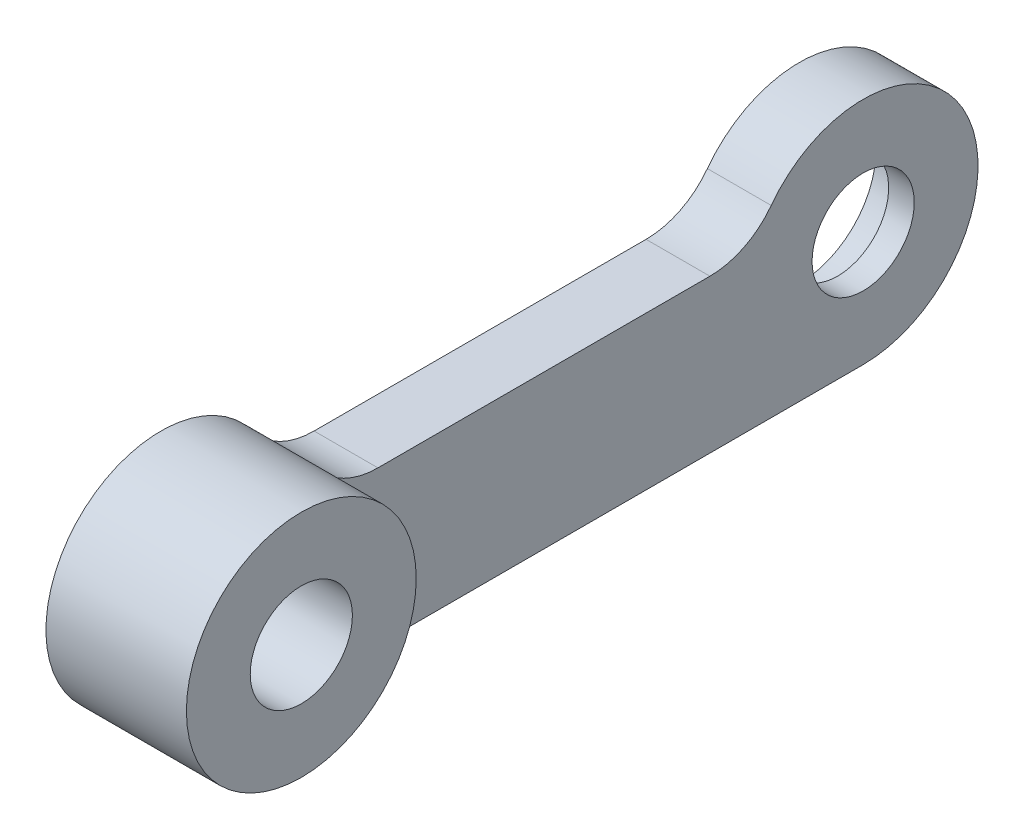
ISO-10303-21;
HEADER;
FILE_DESCRIPTION(('STEP AP214'),'2;1');
FILE_NAME('part.step','',(''),(''),'','','');
FILE_SCHEMA(('AUTOMOTIVE_DESIGN { 1 0 10303 214 1 1 1 1 }'));
ENDSEC;
DATA;
#1=APPLICATION_CONTEXT('core data for automotive mechanical design processes');
#2=APPLICATION_PROTOCOL_DEFINITION('international standard','automotive_design',2000,#1);
#3=PRODUCT_CONTEXT('',#1,'mechanical');
#4=PRODUCT('Part','Part','',(#3));
#5=PRODUCT_RELATED_PRODUCT_CATEGORY('part','',(#4));
#6=PRODUCT_DEFINITION_FORMATION('','',#4);
#7=PRODUCT_DEFINITION_CONTEXT('part definition',#1,'design');
#8=PRODUCT_DEFINITION('design','',#6,#7);
#9=PRODUCT_DEFINITION_SHAPE('','',#8);
#10=(LENGTH_UNIT() NAMED_UNIT(*) SI_UNIT(.MILLI.,.METRE.));
#11=(NAMED_UNIT(*) PLANE_ANGLE_UNIT() SI_UNIT($,.RADIAN.));
#12=(NAMED_UNIT(*) SI_UNIT($,.STERADIAN.) SOLID_ANGLE_UNIT());
#13=UNCERTAINTY_MEASURE_WITH_UNIT(LENGTH_MEASURE(1.E-05),#10,'distance_accuracy_value','');
#14=(GEOMETRIC_REPRESENTATION_CONTEXT(3) GLOBAL_UNCERTAINTY_ASSIGNED_CONTEXT((#13)) GLOBAL_UNIT_ASSIGNED_CONTEXT((#10,
#11,#12)) REPRESENTATION_CONTEXT('',''));
#15=CARTESIAN_POINT('',(0.,0.,0.));
#16=DIRECTION('',(0.,0.,1.));
#17=DIRECTION('',(1.,0.,0.));
#18=AXIS2_PLACEMENT_3D('',#15,#16,#17);
#19=CARTESIAN_POINT('',(5.5,-1.5,0.));
#20=DIRECTION('',(-1.,0.,0.));
#21=DIRECTION('',(0.,0.,1.));
#22=AXIS2_PLACEMENT_3D('',#19,#20,#21);
#23=CYLINDRICAL_SURFACE('',#22,2.);
#24=CARTESIAN_POINT('',(5.5,-1.5,0.));
#25=DIRECTION('',(1.,0.,0.));
#26=DIRECTION('',(0.,0.,-1.));
#27=AXIS2_PLACEMENT_3D('',#24,#25,#26);
#28=CIRCLE('',#27,2.);
#29=CARTESIAN_POINT('',(5.5,-1.5,-2.));
#30=VERTEX_POINT('',#29);
#31=EDGE_CURVE('E193',#30,#30,#28,.T.);
#32=ORIENTED_EDGE('',*,*,#31,.T.);
#33=EDGE_LOOP('',(#32));
#34=FACE_BOUND('',#33,.T.);
#35=CARTESIAN_POINT('',(1.5,-1.5,0.));
#36=DIRECTION('',(-1.,0.,0.));
#37=DIRECTION('',(0.,0.,1.));
#38=AXIS2_PLACEMENT_3D('',#35,#36,#37);
#39=CIRCLE('',#38,2.);
#40=CARTESIAN_POINT('',(1.5,-1.5,2.));
#41=VERTEX_POINT('',#40);
#42=EDGE_CURVE('E73',#41,#41,#39,.T.);
#43=ORIENTED_EDGE('',*,*,#42,.T.);
#44=EDGE_LOOP('',(#43));
#45=FACE_BOUND('',#44,.T.);
#46=ADVANCED_FACE('F69',(#34,#45),#23,.F.);
#47=CARTESIAN_POINT('',(5.5,-1.5,-25.));
#48=DIRECTION('',(-1.,0.,0.));
#49=DIRECTION('',(0.,0.,1.));
#50=AXIS2_PLACEMENT_3D('',#47,#48,#49);
#51=CYLINDRICAL_SURFACE('',#50,2.);
#52=CARTESIAN_POINT('',(2.5,-1.5,-25.));
#53=DIRECTION('',(1.,0.,0.));
#54=DIRECTION('',(0.,0.,-1.));
#55=AXIS2_PLACEMENT_3D('',#52,#53,#54);
#56=CIRCLE('',#55,2.);
#57=CARTESIAN_POINT('',(2.5,-1.5,-27.));
#58=VERTEX_POINT('',#57);
#59=EDGE_CURVE('E214',#58,#58,#56,.F.);
#60=ORIENTED_EDGE('',*,*,#59,.F.);
#61=EDGE_LOOP('',(#60));
#62=FACE_BOUND('',#61,.T.);
#63=CARTESIAN_POINT('',(1.5,-1.5,-25.));
#64=DIRECTION('',(-1.,0.,0.));
#65=DIRECTION('',(0.,0.,1.));
#66=AXIS2_PLACEMENT_3D('',#63,#64,#65);
#67=CIRCLE('',#66,2.);
#68=CARTESIAN_POINT('',(1.5,-1.5,-23.));
#69=VERTEX_POINT('',#68);
#70=EDGE_CURVE('E184',#69,#69,#67,.T.);
#71=ORIENTED_EDGE('',*,*,#70,.T.);
#72=EDGE_LOOP('',(#71));
#73=FACE_BOUND('',#72,.T.);
#74=ADVANCED_FACE('F241',(#62,#73),#51,.F.);
#75=CARTESIAN_POINT('',(2.5,-1.5,0.));
#76=DIRECTION('',(1.,0.,0.));
#77=DIRECTION('',(0.,0.,-1.));
#78=AXIS2_PLACEMENT_3D('',#75,#76,#77);
#79=PLANE('',#78);
#80=ORIENTED_EDGE('',*,*,#59,.T.);
#81=EDGE_LOOP('',(#80));
#82=FACE_BOUND('',#81,.T.);
#83=CARTESIAN_POINT('',(2.5,-1.5,0.));
#84=DIRECTION('',(1.,0.,0.));
#85=DIRECTION('',(0.,0.,-1.));
#86=AXIS2_PLACEMENT_3D('',#83,#84,#85);
#87=CIRCLE('',#86,4.5);
#88=CARTESIAN_POINT('',(2.5,-6.,0.));
#89=VERTEX_POINT('',#88);
#90=CARTESIAN_POINT('',(2.5,1.2,-3.6));
#91=VERTEX_POINT('',#90);
#92=EDGE_CURVE('E87',#89,#91,#87,.T.);
#93=ORIENTED_EDGE('',*,*,#92,.F.);
#94=DIRECTION('',(0.,0.,-1.));
#95=VECTOR('',#94,1.);
#96=CARTESIAN_POINT('',(2.5,-6.,0.));
#97=LINE('',#96,#95);
#98=CARTESIAN_POINT('',(2.5,-6.,-25.));
#99=VERTEX_POINT('',#98);
#100=EDGE_CURVE('E139',#89,#99,#97,.T.);
#101=ORIENTED_EDGE('',*,*,#100,.T.);
#102=CARTESIAN_POINT('',(2.5,-1.5,-25.));
#103=DIRECTION('',(1.,0.,0.));
#104=DIRECTION('',(0.,0.,-1.));
#105=AXIS2_PLACEMENT_3D('',#102,#103,#104);
#106=CIRCLE('',#105,4.5);
#107=CARTESIAN_POINT('',(2.5,1.2,-21.4));
#108=VERTEX_POINT('',#107);
#109=EDGE_CURVE('E148',#99,#108,#106,.T.);
#110=ORIENTED_EDGE('',*,*,#109,.T.);
#111=CARTESIAN_POINT('',(2.5,3.,-19.));
#112=DIRECTION('',(1.,0.,0.));
#113=DIRECTION('',(0.,0.,-1.));
#114=AXIS2_PLACEMENT_3D('',#111,#112,#113);
#115=CIRCLE('',#114,3.);
#116=CARTESIAN_POINT('',(2.5,0.,-19.));
#117=VERTEX_POINT('',#116);
#118=EDGE_CURVE('E180',#108,#117,#115,.F.);
#119=ORIENTED_EDGE('',*,*,#118,.T.);
#120=DIRECTION('',(0.,0.,-1.));
#121=VECTOR('',#120,1.);
#122=CARTESIAN_POINT('',(2.5,0.,0.));
#123=LINE('',#122,#121);
#124=CARTESIAN_POINT('',(2.5,0.,-6.));
#125=VERTEX_POINT('',#124);
#126=EDGE_CURVE('E157',#125,#117,#123,.T.);
#127=ORIENTED_EDGE('',*,*,#126,.F.);
#128=CARTESIAN_POINT('',(2.5,3.,-6.));
#129=DIRECTION('',(1.,0.,0.));
#130=DIRECTION('',(0.,0.,-1.));
#131=AXIS2_PLACEMENT_3D('',#128,#129,#130);
#132=CIRCLE('',#131,3.);
#133=EDGE_CURVE('E12',#125,#91,#132,.F.);
#134=ORIENTED_EDGE('',*,*,#133,.T.);
#135=EDGE_LOOP('',(#93,#101,#110,#119,#127,#134));
#136=FACE_BOUND('',#135,.T.);
#137=ADVANCED_FACE('F239',(#82,#136),#79,.T.);
#138=CARTESIAN_POINT('',(2.5,-1.5,0.));
#139=DIRECTION('',(-1.,0.,0.));
#140=DIRECTION('',(0.,0.,1.));
#141=AXIS2_PLACEMENT_3D('',#138,#139,#140);
#142=CYLINDRICAL_SURFACE('',#141,4.5);
#143=ORIENTED_EDGE('',*,*,#92,.T.);
#144=DIRECTION('',(-1.,0.,0.));
#145=VECTOR('',#144,1.);
#146=CARTESIAN_POINT('',(2.5,1.2,-3.6));
#147=LINE('',#146,#145);
#148=CARTESIAN_POINT('',(0.,1.2,-3.6));
#149=VERTEX_POINT('',#148);
#150=EDGE_CURVE('E128',#91,#149,#147,.T.);
#151=ORIENTED_EDGE('',*,*,#150,.T.);
#152=CARTESIAN_POINT('',(0.,-1.5,0.));
#153=DIRECTION('',(1.,0.,0.));
#154=DIRECTION('',(0.,0.,-1.));
#155=AXIS2_PLACEMENT_3D('',#152,#153,#154);
#156=CIRCLE('',#155,4.5);
#157=CARTESIAN_POINT('',(0.,-6.,0.));
#158=VERTEX_POINT('',#157);
#159=EDGE_CURVE('E122',#149,#158,#156,.T.);
#160=ORIENTED_EDGE('',*,*,#159,.T.);
#161=DIRECTION('',(-1.,0.,0.));
#162=VECTOR('',#161,1.);
#163=CARTESIAN_POINT('',(2.5,-6.,0.));
#164=LINE('',#163,#162);
#165=EDGE_CURVE('E126',#89,#158,#164,.T.);
#166=ORIENTED_EDGE('',*,*,#165,.F.);
#167=EDGE_LOOP('',(#143,#151,#160,#166));
#168=FACE_BOUND('',#167,.T.);
#169=CARTESIAN_POINT('',(5.5,-1.5,0.));
#170=DIRECTION('',(1.,0.,0.));
#171=DIRECTION('',(0.,0.,-1.));
#172=AXIS2_PLACEMENT_3D('',#169,#170,#171);
#173=CIRCLE('',#172,4.5);
#174=CARTESIAN_POINT('',(5.5,-1.5,-4.5));
#175=VERTEX_POINT('',#174);
#176=EDGE_CURVE('E164',#175,#175,#173,.T.);
#177=ORIENTED_EDGE('',*,*,#176,.F.);
#178=EDGE_LOOP('',(#177));
#179=FACE_BOUND('',#178,.T.);
#180=ADVANCED_FACE('F124',(#168,#179),#142,.T.);
#181=CARTESIAN_POINT('',(0.,-1.5,0.));
#182=DIRECTION('',(1.,0.,0.));
#183=DIRECTION('',(0.,0.,-1.));
#184=AXIS2_PLACEMENT_3D('',#181,#182,#183);
#185=PLANE('',#184);
#186=CARTESIAN_POINT('',(0.,-1.5,-25.));
#187=DIRECTION('',(-1.,0.,0.));
#188=DIRECTION('',(0.,0.,1.));
#189=AXIS2_PLACEMENT_3D('',#186,#187,#188);
#190=CIRCLE('',#189,3.);
#191=CARTESIAN_POINT('',(0.,-1.5,-22.));
#192=VERTEX_POINT('',#191);
#193=EDGE_CURVE('E195',#192,#192,#190,.T.);
#194=ORIENTED_EDGE('',*,*,#193,.F.);
#195=EDGE_LOOP('',(#194));
#196=FACE_BOUND('',#195,.T.);
#197=CARTESIAN_POINT('',(0.,-1.5,0.));
#198=DIRECTION('',(-1.,0.,0.));
#199=DIRECTION('',(0.,0.,1.));
#200=AXIS2_PLACEMENT_3D('',#197,#198,#199);
#201=CIRCLE('',#200,3.);
#202=CARTESIAN_POINT('',(0.,-1.5,3.));
#203=VERTEX_POINT('',#202);
#204=EDGE_CURVE('E207',#203,#203,#201,.T.);
#205=ORIENTED_EDGE('',*,*,#204,.F.);
#206=EDGE_LOOP('',(#205));
#207=FACE_BOUND('',#206,.T.);
#208=CARTESIAN_POINT('',(0.,-1.5,-25.));
#209=DIRECTION('',(1.,0.,0.));
#210=DIRECTION('',(0.,0.,-1.));
#211=AXIS2_PLACEMENT_3D('',#208,#209,#210);
#212=CIRCLE('',#211,4.5);
#213=CARTESIAN_POINT('',(0.,-6.,-25.));
#214=VERTEX_POINT('',#213);
#215=CARTESIAN_POINT('',(0.,1.2,-21.4));
#216=VERTEX_POINT('',#215);
#217=EDGE_CURVE('E145',#214,#216,#212,.T.);
#218=ORIENTED_EDGE('',*,*,#217,.F.);
#219=DIRECTION('',(0.,0.,-1.));
#220=VECTOR('',#219,1.);
#221=CARTESIAN_POINT('',(0.,-6.,0.));
#222=LINE('',#221,#220);
#223=EDGE_CURVE('E137',#158,#214,#222,.T.);
#224=ORIENTED_EDGE('',*,*,#223,.F.);
#225=ORIENTED_EDGE('',*,*,#159,.F.);
#226=CARTESIAN_POINT('',(0.,3.,-6.));
#227=DIRECTION('',(1.,0.,0.));
#228=DIRECTION('',(0.,0.,-1.));
#229=AXIS2_PLACEMENT_3D('',#226,#227,#228);
#230=CIRCLE('',#229,3.);
#231=CARTESIAN_POINT('',(0.,0.,-6.));
#232=VERTEX_POINT('',#231);
#233=EDGE_CURVE('E79',#149,#232,#230,.T.);
#234=ORIENTED_EDGE('',*,*,#233,.T.);
#235=DIRECTION('',(0.,0.,-1.));
#236=VECTOR('',#235,1.);
#237=CARTESIAN_POINT('',(0.,0.,0.));
#238=LINE('',#237,#236);
#239=CARTESIAN_POINT('',(0.,0.,-19.));
#240=VERTEX_POINT('',#239);
#241=EDGE_CURVE('E147',#232,#240,#238,.T.);
#242=ORIENTED_EDGE('',*,*,#241,.T.);
#243=CARTESIAN_POINT('',(0.,3.,-19.));
#244=DIRECTION('',(1.,0.,0.));
#245=DIRECTION('',(0.,0.,-1.));
#246=AXIS2_PLACEMENT_3D('',#243,#244,#245);
#247=CIRCLE('',#246,3.);
#248=EDGE_CURVE('E177',#240,#216,#247,.T.);
#249=ORIENTED_EDGE('',*,*,#248,.T.);
#250=EDGE_LOOP('',(#218,#224,#225,#234,#242,#249));
#251=FACE_BOUND('',#250,.T.);
#252=ADVANCED_FACE('F143',(#196,#207,#251),#185,.F.);
#253=CARTESIAN_POINT('',(2.5,-1.5,-25.));
#254=DIRECTION('',(-1.,0.,0.));
#255=DIRECTION('',(0.,0.,1.));
#256=AXIS2_PLACEMENT_3D('',#253,#254,#255);
#257=CYLINDRICAL_SURFACE('',#256,4.5);
#258=ORIENTED_EDGE('',*,*,#217,.T.);
#259=DIRECTION('',(-1.,0.,0.));
#260=VECTOR('',#259,1.);
#261=CARTESIAN_POINT('',(2.5,1.2,-21.4));
#262=LINE('',#261,#260);
#263=EDGE_CURVE('E172',#216,#108,#262,.F.);
#264=ORIENTED_EDGE('',*,*,#263,.T.);
#265=ORIENTED_EDGE('',*,*,#109,.F.);
#266=DIRECTION('',(-1.,0.,0.));
#267=VECTOR('',#266,1.);
#268=CARTESIAN_POINT('',(2.5,-6.,-25.));
#269=LINE('',#268,#267);
#270=EDGE_CURVE('E132',#99,#214,#269,.T.);
#271=ORIENTED_EDGE('',*,*,#270,.T.);
#272=EDGE_LOOP('',(#258,#264,#265,#271));
#273=FACE_BOUND('',#272,.T.);
#274=ADVANCED_FACE('F237',(#273),#257,.T.);
#275=CARTESIAN_POINT('',(2.5,0.,0.));
#276=DIRECTION('',(0.,1.,0.));
#277=DIRECTION('',(0.,0.,1.));
#278=AXIS2_PLACEMENT_3D('',#275,#276,#277);
#279=PLANE('',#278);
#280=ORIENTED_EDGE('',*,*,#126,.T.);
#281=DIRECTION('',(-1.,0.,0.));
#282=VECTOR('',#281,1.);
#283=CARTESIAN_POINT('',(2.5,0.,-19.));
#284=LINE('',#283,#282);
#285=EDGE_CURVE('E168',#117,#240,#284,.T.);
#286=ORIENTED_EDGE('',*,*,#285,.T.);
#287=ORIENTED_EDGE('',*,*,#241,.F.);
#288=DIRECTION('',(-1.,0.,0.));
#289=VECTOR('',#288,1.);
#290=CARTESIAN_POINT('',(2.5,0.,-6.));
#291=LINE('',#290,#289);
#292=EDGE_CURVE('E165',#232,#125,#291,.F.);
#293=ORIENTED_EDGE('',*,*,#292,.T.);
#294=EDGE_LOOP('',(#280,#286,#287,#293));
#295=FACE_BOUND('',#294,.T.);
#296=ADVANCED_FACE('F229',(#295),#279,.T.);
#297=CARTESIAN_POINT('',(2.5,-6.,0.));
#298=DIRECTION('',(0.,1.,0.));
#299=DIRECTION('',(0.,0.,1.));
#300=AXIS2_PLACEMENT_3D('',#297,#298,#299);
#301=PLANE('',#300);
#302=ORIENTED_EDGE('',*,*,#223,.T.);
#303=ORIENTED_EDGE('',*,*,#270,.F.);
#304=ORIENTED_EDGE('',*,*,#100,.F.);
#305=ORIENTED_EDGE('',*,*,#165,.T.);
#306=EDGE_LOOP('',(#302,#303,#304,#305));
#307=FACE_BOUND('',#306,.T.);
#308=ADVANCED_FACE('F136',(#307),#301,.F.);
#309=CARTESIAN_POINT('',(5.5,-1.5,0.));
#310=DIRECTION('',(1.,0.,0.));
#311=DIRECTION('',(0.,0.,-1.));
#312=AXIS2_PLACEMENT_3D('',#309,#310,#311);
#313=PLANE('',#312);
#314=ORIENTED_EDGE('',*,*,#31,.F.);
#315=EDGE_LOOP('',(#314));
#316=FACE_BOUND('',#315,.T.);
#317=ORIENTED_EDGE('',*,*,#176,.T.);
#318=EDGE_LOOP('',(#317));
#319=FACE_BOUND('',#318,.T.);
#320=ADVANCED_FACE('F244',(#316,#319),#313,.T.);
#321=CARTESIAN_POINT('',(2.5,3.,-19.));
#322=DIRECTION('',(-1.,0.,0.));
#323=DIRECTION('',(0.,0.,1.));
#324=AXIS2_PLACEMENT_3D('',#321,#322,#323);
#325=CYLINDRICAL_SURFACE('',#324,3.);
#326=ORIENTED_EDGE('',*,*,#118,.F.);
#327=ORIENTED_EDGE('',*,*,#263,.F.);
#328=ORIENTED_EDGE('',*,*,#248,.F.);
#329=ORIENTED_EDGE('',*,*,#285,.F.);
#330=EDGE_LOOP('',(#326,#327,#328,#329));
#331=FACE_BOUND('',#330,.T.);
#332=ADVANCED_FACE('F234',(#331),#325,.F.);
#333=CARTESIAN_POINT('',(2.5,3.,-6.));
#334=DIRECTION('',(-1.,0.,0.));
#335=DIRECTION('',(0.,0.,1.));
#336=AXIS2_PLACEMENT_3D('',#333,#334,#335);
#337=CYLINDRICAL_SURFACE('',#336,3.);
#338=ORIENTED_EDGE('',*,*,#133,.F.);
#339=ORIENTED_EDGE('',*,*,#292,.F.);
#340=ORIENTED_EDGE('',*,*,#233,.F.);
#341=ORIENTED_EDGE('',*,*,#150,.F.);
#342=EDGE_LOOP('',(#338,#339,#340,#341));
#343=FACE_BOUND('',#342,.T.);
#344=ADVANCED_FACE('F71',(#343),#337,.F.);
#345=CARTESIAN_POINT('',(1.5,-1.5,-25.));
#346=DIRECTION('',(-1.,0.,0.));
#347=DIRECTION('',(0.,0.,1.));
#348=AXIS2_PLACEMENT_3D('',#345,#346,#347);
#349=CYLINDRICAL_SURFACE('',#348,3.);
#350=CARTESIAN_POINT('',(1.5,-1.5,-25.));
#351=DIRECTION('',(-1.,0.,0.));
#352=DIRECTION('',(0.,0.,1.));
#353=AXIS2_PLACEMENT_3D('',#350,#351,#352);
#354=CIRCLE('',#353,3.);
#355=CARTESIAN_POINT('',(1.5,-1.5,-22.));
#356=VERTEX_POINT('',#355);
#357=EDGE_CURVE('E187',#356,#356,#354,.T.);
#358=ORIENTED_EDGE('',*,*,#357,.F.);
#359=EDGE_LOOP('',(#358));
#360=FACE_BOUND('',#359,.T.);
#361=ORIENTED_EDGE('',*,*,#193,.T.);
#362=EDGE_LOOP('',(#361));
#363=FACE_BOUND('',#362,.T.);
#364=ADVANCED_FACE('F274',(#360,#363),#349,.F.);
#365=CARTESIAN_POINT('',(1.5,-1.5,-25.));
#366=DIRECTION('',(-1.,0.,0.));
#367=DIRECTION('',(0.,0.,1.));
#368=AXIS2_PLACEMENT_3D('',#365,#366,#367);
#369=PLANE('',#368);
#370=ORIENTED_EDGE('',*,*,#70,.F.);
#371=EDGE_LOOP('',(#370));
#372=FACE_BOUND('',#371,.T.);
#373=ORIENTED_EDGE('',*,*,#357,.T.);
#374=EDGE_LOOP('',(#373));
#375=FACE_BOUND('',#374,.T.);
#376=ADVANCED_FACE('F269',(#372,#375),#369,.T.);
#377=CARTESIAN_POINT('',(1.5,-1.5,0.));
#378=DIRECTION('',(-1.,0.,0.));
#379=DIRECTION('',(0.,0.,1.));
#380=AXIS2_PLACEMENT_3D('',#377,#378,#379);
#381=CYLINDRICAL_SURFACE('',#380,3.);
#382=CARTESIAN_POINT('',(1.5,-1.5,0.));
#383=DIRECTION('',(-1.,0.,0.));
#384=DIRECTION('',(0.,0.,1.));
#385=AXIS2_PLACEMENT_3D('',#382,#383,#384);
#386=CIRCLE('',#385,3.);
#387=CARTESIAN_POINT('',(1.5,-1.5,3.));
#388=VERTEX_POINT('',#387);
#389=EDGE_CURVE('E201',#388,#388,#386,.T.);
#390=ORIENTED_EDGE('',*,*,#389,.F.);
#391=EDGE_LOOP('',(#390));
#392=FACE_BOUND('',#391,.T.);
#393=ORIENTED_EDGE('',*,*,#204,.T.);
#394=EDGE_LOOP('',(#393));
#395=FACE_BOUND('',#394,.T.);
#396=ADVANCED_FACE('F265',(#392,#395),#381,.F.);
#397=CARTESIAN_POINT('',(1.5,-1.5,0.));
#398=DIRECTION('',(-1.,0.,0.));
#399=DIRECTION('',(0.,0.,1.));
#400=AXIS2_PLACEMENT_3D('',#397,#398,#399);
#401=PLANE('',#400);
#402=ORIENTED_EDGE('',*,*,#42,.F.);
#403=EDGE_LOOP('',(#402));
#404=FACE_BOUND('',#403,.T.);
#405=ORIENTED_EDGE('',*,*,#389,.T.);
#406=EDGE_LOOP('',(#405));
#407=FACE_BOUND('',#406,.T.);
#408=ADVANCED_FACE('F268',(#404,#407),#401,.T.);
#409=CLOSED_SHELL('',(#46,#74,#137,#180,#252,#274,#296,#308,#320,#332,#344,#364,#376,#396,#408));
#410=MANIFOLD_SOLID_BREP('B2',#409);
#411=ADVANCED_BREP_SHAPE_REPRESENTATION('',(#18,#410),#14);
#412=SHAPE_DEFINITION_REPRESENTATION(#9,#411);
ENDSEC;
END-ISO-10303-21;
